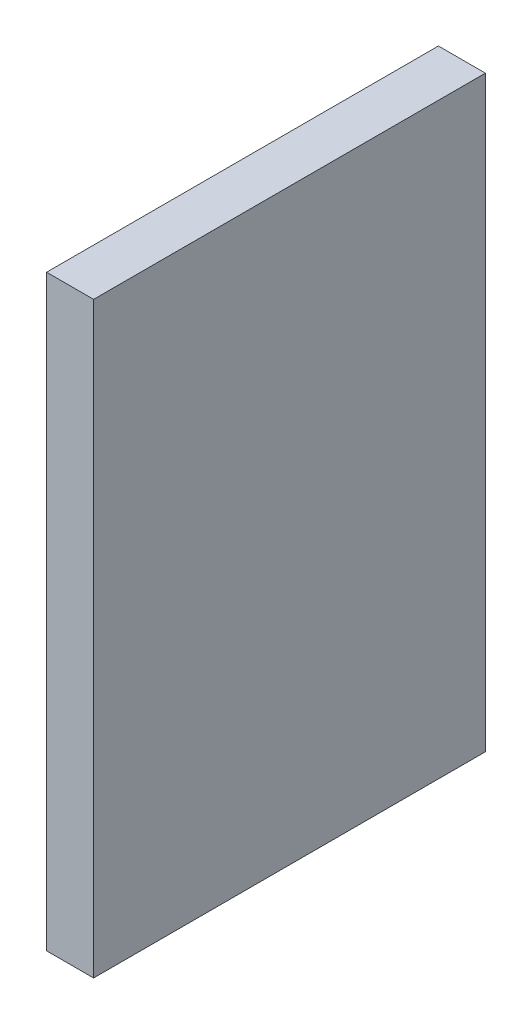
ISO-10303-21;
HEADER;
FILE_DESCRIPTION(('STEP AP214'),'2;1');
FILE_NAME('part.step','',(''),(''),'','','');
FILE_SCHEMA(('AUTOMOTIVE_DESIGN { 1 0 10303 214 1 1 1 1 }'));
ENDSEC;
DATA;
#1=APPLICATION_CONTEXT('core data for automotive mechanical design processes');
#2=APPLICATION_PROTOCOL_DEFINITION('international standard','automotive_design',2000,#1);
#3=PRODUCT_CONTEXT('',#1,'mechanical');
#4=PRODUCT('Part','Part','',(#3));
#5=PRODUCT_RELATED_PRODUCT_CATEGORY('part','',(#4));
#6=PRODUCT_DEFINITION_FORMATION('','',#4);
#7=PRODUCT_DEFINITION_CONTEXT('part definition',#1,'design');
#8=PRODUCT_DEFINITION('design','',#6,#7);
#9=PRODUCT_DEFINITION_SHAPE('','',#8);
#10=(LENGTH_UNIT() NAMED_UNIT(*) SI_UNIT(.MILLI.,.METRE.));
#11=(NAMED_UNIT(*) PLANE_ANGLE_UNIT() SI_UNIT($,.RADIAN.));
#12=(NAMED_UNIT(*) SI_UNIT($,.STERADIAN.) SOLID_ANGLE_UNIT());
#13=UNCERTAINTY_MEASURE_WITH_UNIT(LENGTH_MEASURE(1.E-05),#10,'distance_accuracy_value','');
#14=(GEOMETRIC_REPRESENTATION_CONTEXT(3) GLOBAL_UNCERTAINTY_ASSIGNED_CONTEXT((#13)) GLOBAL_UNIT_ASSIGNED_CONTEXT((#10,
#11,#12)) REPRESENTATION_CONTEXT('',''));
#15=CARTESIAN_POINT('',(0.,0.,0.));
#16=DIRECTION('',(0.,0.,1.));
#17=DIRECTION('',(1.,0.,0.));
#18=AXIS2_PLACEMENT_3D('',#15,#16,#17);
#19=CARTESIAN_POINT('',(12.,75.,-50.));
#20=DIRECTION('',(0.,-1.,0.));
#21=DIRECTION('',(0.,0.,-1.));
#22=AXIS2_PLACEMENT_3D('',#19,#20,#21);
#23=PLANE('',#22);
#24=DIRECTION('',(0.,0.,1.));
#25=VECTOR('',#24,1.);
#26=CARTESIAN_POINT('',(0.,75.,-50.));
#27=LINE('',#26,#25);
#28=CARTESIAN_POINT('',(0.,75.,-50.));
#29=VERTEX_POINT('',#28);
#30=CARTESIAN_POINT('',(0.,75.,50.));
#31=VERTEX_POINT('',#30);
#32=EDGE_CURVE('E102',#29,#31,#27,.T.);
#33=ORIENTED_EDGE('',*,*,#32,.T.);
#34=DIRECTION('',(-1.,0.,0.));
#35=VECTOR('',#34,1.);
#36=CARTESIAN_POINT('',(12.,75.,50.));
#37=LINE('',#36,#35);
#38=CARTESIAN_POINT('',(12.,75.,50.));
#39=VERTEX_POINT('',#38);
#40=EDGE_CURVE('E11',#39,#31,#37,.T.);
#41=ORIENTED_EDGE('',*,*,#40,.F.);
#42=DIRECTION('',(0.,0.,1.));
#43=VECTOR('',#42,1.);
#44=CARTESIAN_POINT('',(12.,75.,-50.));
#45=LINE('',#44,#43);
#46=CARTESIAN_POINT('',(12.,75.,-50.));
#47=VERTEX_POINT('',#46);
#48=EDGE_CURVE('E90',#47,#39,#45,.T.);
#49=ORIENTED_EDGE('',*,*,#48,.F.);
#50=DIRECTION('',(-1.,0.,0.));
#51=VECTOR('',#50,1.);
#52=CARTESIAN_POINT('',(12.,75.,-50.));
#53=LINE('',#52,#51);
#54=EDGE_CURVE('E98',#47,#29,#53,.T.);
#55=ORIENTED_EDGE('',*,*,#54,.T.);
#56=EDGE_LOOP('',(#33,#41,#49,#55));
#57=FACE_BOUND('',#56,.T.);
#58=ADVANCED_FACE('F39',(#57),#23,.F.);
#59=CARTESIAN_POINT('',(12.,-75.,50.));
#60=DIRECTION('',(0.,0.,-1.));
#61=DIRECTION('',(-1.,0.,0.));
#62=AXIS2_PLACEMENT_3D('',#59,#60,#61);
#63=PLANE('',#62);
#64=DIRECTION('',(0.,-1.,0.));
#65=VECTOR('',#64,1.);
#66=CARTESIAN_POINT('',(0.,-75.,50.));
#67=LINE('',#66,#65);
#68=CARTESIAN_POINT('',(0.,-75.,50.));
#69=VERTEX_POINT('',#68);
#70=EDGE_CURVE('E94',#31,#69,#67,.T.);
#71=ORIENTED_EDGE('',*,*,#70,.T.);
#72=DIRECTION('',(-1.,0.,0.));
#73=VECTOR('',#72,1.);
#74=CARTESIAN_POINT('',(12.,-75.,50.));
#75=LINE('',#74,#73);
#76=CARTESIAN_POINT('',(12.,-75.,50.));
#77=VERTEX_POINT('',#76);
#78=EDGE_CURVE('E47',#77,#69,#75,.T.);
#79=ORIENTED_EDGE('',*,*,#78,.F.);
#80=DIRECTION('',(0.,-1.,0.));
#81=VECTOR('',#80,1.);
#82=CARTESIAN_POINT('',(12.,-75.,50.));
#83=LINE('',#82,#81);
#84=EDGE_CURVE('E85',#39,#77,#83,.T.);
#85=ORIENTED_EDGE('',*,*,#84,.F.);
#86=ORIENTED_EDGE('',*,*,#40,.T.);
#87=EDGE_LOOP('',(#71,#79,#85,#86));
#88=FACE_BOUND('',#87,.T.);
#89=ADVANCED_FACE('F93',(#88),#63,.F.);
#90=CARTESIAN_POINT('',(12.,-75.,-50.));
#91=DIRECTION('',(0.,1.,0.));
#92=DIRECTION('',(0.,0.,1.));
#93=AXIS2_PLACEMENT_3D('',#90,#91,#92);
#94=PLANE('',#93);
#95=DIRECTION('',(0.,0.,-1.));
#96=VECTOR('',#95,1.);
#97=CARTESIAN_POINT('',(0.,-75.,-50.));
#98=LINE('',#97,#96);
#99=CARTESIAN_POINT('',(0.,-75.,-50.));
#100=VERTEX_POINT('',#99);
#101=EDGE_CURVE('E72',#69,#100,#98,.T.);
#102=ORIENTED_EDGE('',*,*,#101,.T.);
#103=DIRECTION('',(-1.,0.,0.));
#104=VECTOR('',#103,1.);
#105=CARTESIAN_POINT('',(12.,-75.,-50.));
#106=LINE('',#105,#104);
#107=CARTESIAN_POINT('',(12.,-75.,-50.));
#108=VERTEX_POINT('',#107);
#109=EDGE_CURVE('E95',#108,#100,#106,.T.);
#110=ORIENTED_EDGE('',*,*,#109,.F.);
#111=DIRECTION('',(0.,0.,-1.));
#112=VECTOR('',#111,1.);
#113=CARTESIAN_POINT('',(12.,-75.,-50.));
#114=LINE('',#113,#112);
#115=EDGE_CURVE('E88',#77,#108,#114,.T.);
#116=ORIENTED_EDGE('',*,*,#115,.F.);
#117=ORIENTED_EDGE('',*,*,#78,.T.);
#118=EDGE_LOOP('',(#102,#110,#116,#117));
#119=FACE_BOUND('',#118,.T.);
#120=ADVANCED_FACE('F96',(#119),#94,.F.);
#121=CARTESIAN_POINT('',(12.,-75.,-50.));
#122=DIRECTION('',(0.,0.,1.));
#123=DIRECTION('',(1.,0.,0.));
#124=AXIS2_PLACEMENT_3D('',#121,#122,#123);
#125=PLANE('',#124);
#126=DIRECTION('',(0.,1.,0.));
#127=VECTOR('',#126,1.);
#128=CARTESIAN_POINT('',(0.,-75.,-50.));
#129=LINE('',#128,#127);
#130=EDGE_CURVE('E78',#100,#29,#129,.T.);
#131=ORIENTED_EDGE('',*,*,#130,.T.);
#132=ORIENTED_EDGE('',*,*,#54,.F.);
#133=DIRECTION('',(0.,1.,0.));
#134=VECTOR('',#133,1.);
#135=CARTESIAN_POINT('',(12.,-75.,-50.));
#136=LINE('',#135,#134);
#137=EDGE_CURVE('E55',#108,#47,#136,.T.);
#138=ORIENTED_EDGE('',*,*,#137,.F.);
#139=ORIENTED_EDGE('',*,*,#109,.T.);
#140=EDGE_LOOP('',(#131,#132,#138,#139));
#141=FACE_BOUND('',#140,.T.);
#142=ADVANCED_FACE('F109',(#141),#125,.F.);
#143=CARTESIAN_POINT('',(12.,0.,0.));
#144=DIRECTION('',(-1.,0.,0.));
#145=DIRECTION('',(0.,0.,1.));
#146=AXIS2_PLACEMENT_3D('',#143,#144,#145);
#147=PLANE('',#146);
#148=ORIENTED_EDGE('',*,*,#48,.T.);
#149=ORIENTED_EDGE('',*,*,#84,.T.);
#150=ORIENTED_EDGE('',*,*,#115,.T.);
#151=ORIENTED_EDGE('',*,*,#137,.T.);
#152=EDGE_LOOP('',(#148,#149,#150,#151));
#153=FACE_BOUND('',#152,.T.);
#154=ADVANCED_FACE('F86',(#153),#147,.F.);
#155=CARTESIAN_POINT('',(0.,0.,0.));
#156=DIRECTION('',(-1.,0.,0.));
#157=DIRECTION('',(0.,0.,1.));
#158=AXIS2_PLACEMENT_3D('',#155,#156,#157);
#159=PLANE('',#158);
#160=ORIENTED_EDGE('',*,*,#32,.F.);
#161=ORIENTED_EDGE('',*,*,#130,.F.);
#162=ORIENTED_EDGE('',*,*,#101,.F.);
#163=ORIENTED_EDGE('',*,*,#70,.F.);
#164=EDGE_LOOP('',(#160,#161,#162,#163));
#165=FACE_BOUND('',#164,.T.);
#166=ADVANCED_FACE('F112',(#165),#159,.T.);
#167=CLOSED_SHELL('',(#58,#89,#120,#142,#154,#166));
#168=MANIFOLD_SOLID_BREP('B2',#167);
#169=ADVANCED_BREP_SHAPE_REPRESENTATION('',(#18,#168),#14);
#170=SHAPE_DEFINITION_REPRESENTATION(#9,#169);
ENDSEC;
END-ISO-10303-21;
